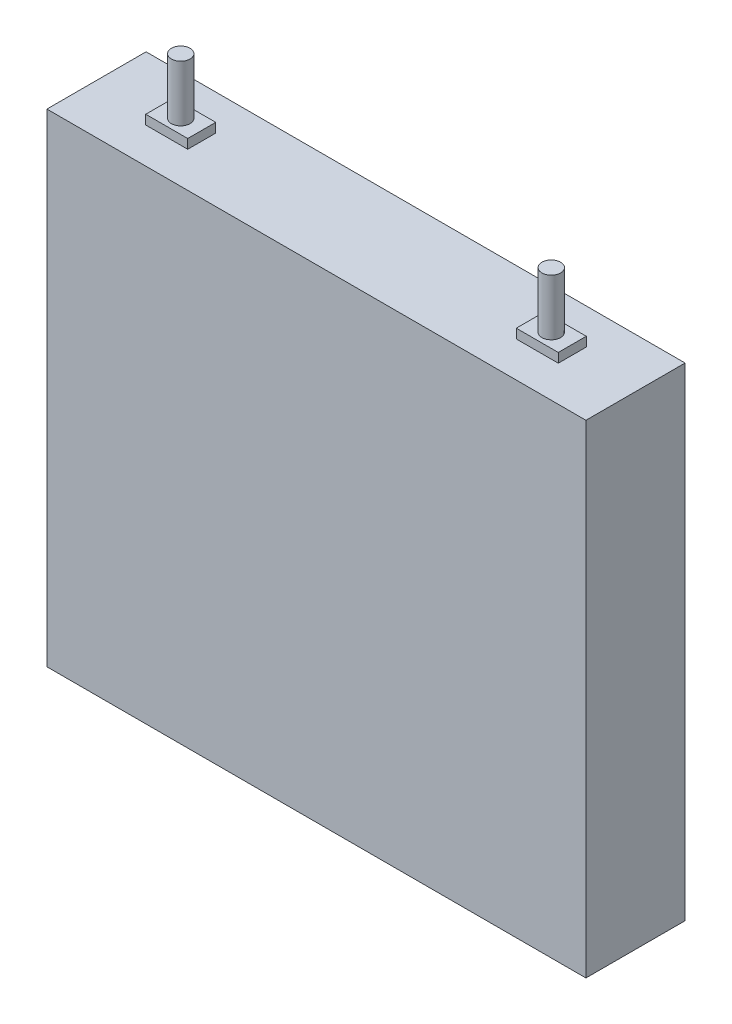
ISO-10303-21;
HEADER;
FILE_DESCRIPTION(('STEP AP214'),'2;1');
FILE_NAME('part.step','',(''),(''),'','','');
FILE_SCHEMA(('AUTOMOTIVE_DESIGN { 1 0 10303 214 1 1 1 1 }'));
ENDSEC;
DATA;
#1=APPLICATION_CONTEXT('core data for automotive mechanical design processes');
#2=APPLICATION_PROTOCOL_DEFINITION('international standard','automotive_design',2000,#1);
#3=PRODUCT_CONTEXT('',#1,'mechanical');
#4=PRODUCT('Part','Part','',(#3));
#5=PRODUCT_RELATED_PRODUCT_CATEGORY('part','',(#4));
#6=PRODUCT_DEFINITION_FORMATION('','',#4);
#7=PRODUCT_DEFINITION_CONTEXT('part definition',#1,'design');
#8=PRODUCT_DEFINITION('design','',#6,#7);
#9=PRODUCT_DEFINITION_SHAPE('','',#8);
#10=(LENGTH_UNIT() NAMED_UNIT(*) SI_UNIT(.MILLI.,.METRE.));
#11=(NAMED_UNIT(*) PLANE_ANGLE_UNIT() SI_UNIT($,.RADIAN.));
#12=(NAMED_UNIT(*) SI_UNIT($,.STERADIAN.) SOLID_ANGLE_UNIT());
#13=UNCERTAINTY_MEASURE_WITH_UNIT(LENGTH_MEASURE(1.E-05),#10,'distance_accuracy_value','');
#14=(GEOMETRIC_REPRESENTATION_CONTEXT(3) GLOBAL_UNCERTAINTY_ASSIGNED_CONTEXT((#13)) GLOBAL_UNIT_ASSIGNED_CONTEXT((#10,
#11,#12)) REPRESENTATION_CONTEXT('',''));
#15=CARTESIAN_POINT('',(0.,0.,0.));
#16=DIRECTION('',(0.,0.,1.));
#17=DIRECTION('',(1.,0.,0.));
#18=AXIS2_PLACEMENT_3D('',#15,#16,#17);
#19=CARTESIAN_POINT('',(57.75,51.75,10.625));
#20=DIRECTION('',(0.,-1.,0.));
#21=DIRECTION('',(1.,0.,0.));
#22=AXIS2_PLACEMENT_3D('',#19,#20,#21);
#23=PLANE('',#22);
#24=DIRECTION('',(0.,0.,1.));
#25=VECTOR('',#24,1.);
#26=CARTESIAN_POINT('',(-44.2,51.75,3.));
#27=LINE('',#26,#25);
#28=CARTESIAN_POINT('',(-44.2,51.75,-3.));
#29=VERTEX_POINT('',#28);
#30=CARTESIAN_POINT('',(-44.2,51.75,3.));
#31=VERTEX_POINT('',#30);
#32=EDGE_CURVE('E130',#29,#31,#27,.T.);
#33=ORIENTED_EDGE('',*,*,#32,.F.);
#34=DIRECTION('',(-1.,0.,0.));
#35=VECTOR('',#34,1.);
#36=CARTESIAN_POINT('',(-35.2,51.75,-3.));
#37=LINE('',#36,#35);
#38=CARTESIAN_POINT('',(-35.2,51.75,-3.));
#39=VERTEX_POINT('',#38);
#40=EDGE_CURVE('E163',#39,#29,#37,.T.);
#41=ORIENTED_EDGE('',*,*,#40,.F.);
#42=DIRECTION('',(0.,0.,-1.));
#43=VECTOR('',#42,1.);
#44=CARTESIAN_POINT('',(-35.2,51.75,3.));
#45=LINE('',#44,#43);
#46=CARTESIAN_POINT('',(-35.2,51.75,3.));
#47=VERTEX_POINT('',#46);
#48=EDGE_CURVE('E175',#47,#39,#45,.T.);
#49=ORIENTED_EDGE('',*,*,#48,.F.);
#50=DIRECTION('',(1.,0.,0.));
#51=VECTOR('',#50,1.);
#52=CARTESIAN_POINT('',(-35.2,51.75,3.));
#53=LINE('',#52,#51);
#54=EDGE_CURVE('E172',#31,#47,#53,.T.);
#55=ORIENTED_EDGE('',*,*,#54,.F.);
#56=EDGE_LOOP('',(#33,#41,#49,#55));
#57=FACE_BOUND('',#56,.T.);
#58=DIRECTION('',(-1.,0.,0.));
#59=VECTOR('',#58,1.);
#60=CARTESIAN_POINT('',(57.75,51.75,-10.625));
#61=LINE('',#60,#59);
#62=CARTESIAN_POINT('',(57.75,51.75,-10.625));
#63=VERTEX_POINT('',#62);
#64=CARTESIAN_POINT('',(-57.75,51.75,-10.625));
#65=VERTEX_POINT('',#64);
#66=EDGE_CURVE('E196',#63,#65,#61,.T.);
#67=ORIENTED_EDGE('',*,*,#66,.T.);
#68=DIRECTION('',(0.,0.,-1.));
#69=VECTOR('',#68,1.);
#70=CARTESIAN_POINT('',(-57.75,51.75,10.625));
#71=LINE('',#70,#69);
#72=CARTESIAN_POINT('',(-57.75,51.75,10.625));
#73=VERTEX_POINT('',#72);
#74=EDGE_CURVE('E202',#73,#65,#71,.T.);
#75=ORIENTED_EDGE('',*,*,#74,.F.);
#76=DIRECTION('',(-1.,0.,0.));
#77=VECTOR('',#76,1.);
#78=CARTESIAN_POINT('',(57.75,51.75,10.625));
#79=LINE('',#78,#77);
#80=CARTESIAN_POINT('',(57.75,51.75,10.625));
#81=VERTEX_POINT('',#80);
#82=EDGE_CURVE('E200',#81,#73,#79,.T.);
#83=ORIENTED_EDGE('',*,*,#82,.F.);
#84=DIRECTION('',(0.,0.,-1.));
#85=VECTOR('',#84,1.);
#86=CARTESIAN_POINT('',(57.75,51.75,10.625));
#87=LINE('',#86,#85);
#88=EDGE_CURVE('E212',#81,#63,#87,.T.);
#89=ORIENTED_EDGE('',*,*,#88,.T.);
#90=EDGE_LOOP('',(#67,#75,#83,#89));
#91=FACE_BOUND('',#90,.T.);
#92=DIRECTION('',(0.,0.,1.));
#93=VECTOR('',#92,1.);
#94=CARTESIAN_POINT('',(35.2,51.75,2.99999999999999));
#95=LINE('',#94,#93);
#96=CARTESIAN_POINT('',(35.2,51.75,-3.00000000000001));
#97=VERTEX_POINT('',#96);
#98=CARTESIAN_POINT('',(35.2,51.75,2.99999999999999));
#99=VERTEX_POINT('',#98);
#100=EDGE_CURVE('E124',#97,#99,#95,.T.);
#101=ORIENTED_EDGE('',*,*,#100,.F.);
#102=DIRECTION('',(-1.,0.,0.));
#103=VECTOR('',#102,1.);
#104=CARTESIAN_POINT('',(35.2,51.75,-3.00000000000001));
#105=LINE('',#104,#103);
#106=CARTESIAN_POINT('',(44.2,51.75,-3.00000000000001));
#107=VERTEX_POINT('',#106);
#108=EDGE_CURVE('E126',#107,#97,#105,.T.);
#109=ORIENTED_EDGE('',*,*,#108,.F.);
#110=DIRECTION('',(0.,0.,-1.));
#111=VECTOR('',#110,1.);
#112=CARTESIAN_POINT('',(44.2,51.75,2.99999999999999));
#113=LINE('',#112,#111);
#114=CARTESIAN_POINT('',(44.2,51.75,2.99999999999999));
#115=VERTEX_POINT('',#114);
#116=EDGE_CURVE('E59',#115,#107,#113,.T.);
#117=ORIENTED_EDGE('',*,*,#116,.F.);
#118=DIRECTION('',(1.,0.,0.));
#119=VECTOR('',#118,1.);
#120=CARTESIAN_POINT('',(35.2,51.75,2.99999999999999));
#121=LINE('',#120,#119);
#122=EDGE_CURVE('E54',#99,#115,#121,.T.);
#123=ORIENTED_EDGE('',*,*,#122,.F.);
#124=EDGE_LOOP('',(#101,#109,#117,#123));
#125=FACE_BOUND('',#124,.T.);
#126=ADVANCED_FACE('F37',(#57,#91,#125),#23,.F.);
#127=CARTESIAN_POINT('',(-57.75,-51.75,10.625));
#128=DIRECTION('',(1.,0.,0.));
#129=DIRECTION('',(0.,0.,-1.));
#130=AXIS2_PLACEMENT_3D('',#127,#128,#129);
#131=PLANE('',#130);
#132=DIRECTION('',(0.,-1.,0.));
#133=VECTOR('',#132,1.);
#134=CARTESIAN_POINT('',(-57.75,-51.75,-10.625));
#135=LINE('',#134,#133);
#136=CARTESIAN_POINT('',(-57.75,-51.75,-10.625));
#137=VERTEX_POINT('',#136);
#138=EDGE_CURVE('E191',#65,#137,#135,.T.);
#139=ORIENTED_EDGE('',*,*,#138,.T.);
#140=DIRECTION('',(0.,0.,-1.));
#141=VECTOR('',#140,1.);
#142=CARTESIAN_POINT('',(-57.75,-51.75,10.625));
#143=LINE('',#142,#141);
#144=CARTESIAN_POINT('',(-57.75,-51.75,10.625));
#145=VERTEX_POINT('',#144);
#146=EDGE_CURVE('E41',#145,#137,#143,.T.);
#147=ORIENTED_EDGE('',*,*,#146,.F.);
#148=DIRECTION('',(0.,-1.,0.));
#149=VECTOR('',#148,1.);
#150=CARTESIAN_POINT('',(-57.75,-51.75,10.625));
#151=LINE('',#150,#149);
#152=EDGE_CURVE('E192',#73,#145,#151,.T.);
#153=ORIENTED_EDGE('',*,*,#152,.F.);
#154=ORIENTED_EDGE('',*,*,#74,.T.);
#155=EDGE_LOOP('',(#139,#147,#153,#154));
#156=FACE_BOUND('',#155,.T.);
#157=ADVANCED_FACE('F39',(#156),#131,.F.);
#158=CARTESIAN_POINT('',(57.75,-51.75,10.625));
#159=DIRECTION('',(0.,1.,0.));
#160=DIRECTION('',(-1.,0.,0.));
#161=AXIS2_PLACEMENT_3D('',#158,#159,#160);
#162=PLANE('',#161);
#163=DIRECTION('',(1.,0.,0.));
#164=VECTOR('',#163,1.);
#165=CARTESIAN_POINT('',(57.75,-51.75,-10.625));
#166=LINE('',#165,#164);
#167=CARTESIAN_POINT('',(57.75,-51.75,-10.625));
#168=VERTEX_POINT('',#167);
#169=EDGE_CURVE('E205',#137,#168,#166,.T.);
#170=ORIENTED_EDGE('',*,*,#169,.T.);
#171=DIRECTION('',(0.,0.,-1.));
#172=VECTOR('',#171,1.);
#173=CARTESIAN_POINT('',(57.75,-51.75,10.625));
#174=LINE('',#173,#172);
#175=CARTESIAN_POINT('',(57.75,-51.75,10.625));
#176=VERTEX_POINT('',#175);
#177=EDGE_CURVE('E214',#176,#168,#174,.T.);
#178=ORIENTED_EDGE('',*,*,#177,.F.);
#179=DIRECTION('',(1.,0.,0.));
#180=VECTOR('',#179,1.);
#181=CARTESIAN_POINT('',(57.75,-51.75,10.625));
#182=LINE('',#181,#180);
#183=EDGE_CURVE('E195',#145,#176,#182,.T.);
#184=ORIENTED_EDGE('',*,*,#183,.F.);
#185=ORIENTED_EDGE('',*,*,#146,.T.);
#186=EDGE_LOOP('',(#170,#178,#184,#185));
#187=FACE_BOUND('',#186,.T.);
#188=ADVANCED_FACE('F261',(#187),#162,.F.);
#189=CARTESIAN_POINT('',(57.75,-51.75,10.625));
#190=DIRECTION('',(-1.,0.,0.));
#191=DIRECTION('',(0.,0.,1.));
#192=AXIS2_PLACEMENT_3D('',#189,#190,#191);
#193=PLANE('',#192);
#194=DIRECTION('',(0.,1.,0.));
#195=VECTOR('',#194,1.);
#196=CARTESIAN_POINT('',(57.75,-51.75,-10.625));
#197=LINE('',#196,#195);
#198=EDGE_CURVE('E207',#168,#63,#197,.T.);
#199=ORIENTED_EDGE('',*,*,#198,.T.);
#200=ORIENTED_EDGE('',*,*,#88,.F.);
#201=DIRECTION('',(0.,1.,0.));
#202=VECTOR('',#201,1.);
#203=CARTESIAN_POINT('',(57.75,-51.75,10.625));
#204=LINE('',#203,#202);
#205=EDGE_CURVE('E198',#176,#81,#204,.T.);
#206=ORIENTED_EDGE('',*,*,#205,.F.);
#207=ORIENTED_EDGE('',*,*,#177,.T.);
#208=EDGE_LOOP('',(#199,#200,#206,#207));
#209=FACE_BOUND('',#208,.T.);
#210=ADVANCED_FACE('F268',(#209),#193,.F.);
#211=CARTESIAN_POINT('',(0.,0.,10.625));
#212=DIRECTION('',(0.,0.,1.));
#213=DIRECTION('',(1.,0.,0.));
#214=AXIS2_PLACEMENT_3D('',#211,#212,#213);
#215=PLANE('',#214);
#216=ORIENTED_EDGE('',*,*,#152,.T.);
#217=ORIENTED_EDGE('',*,*,#183,.T.);
#218=ORIENTED_EDGE('',*,*,#205,.T.);
#219=ORIENTED_EDGE('',*,*,#82,.T.);
#220=EDGE_LOOP('',(#216,#217,#218,#219));
#221=FACE_BOUND('',#220,.T.);
#222=ADVANCED_FACE('F270',(#221),#215,.T.);
#223=CARTESIAN_POINT('',(0.,0.,-10.625));
#224=DIRECTION('',(0.,0.,1.));
#225=DIRECTION('',(1.,0.,0.));
#226=AXIS2_PLACEMENT_3D('',#223,#224,#225);
#227=PLANE('',#226);
#228=ORIENTED_EDGE('',*,*,#138,.F.);
#229=ORIENTED_EDGE('',*,*,#66,.F.);
#230=ORIENTED_EDGE('',*,*,#198,.F.);
#231=ORIENTED_EDGE('',*,*,#169,.F.);
#232=EDGE_LOOP('',(#228,#229,#230,#231));
#233=FACE_BOUND('',#232,.T.);
#234=ADVANCED_FACE('F266',(#233),#227,.F.);
#235=CARTESIAN_POINT('',(-44.2,53.75,3.));
#236=DIRECTION('',(1.,0.,0.));
#237=DIRECTION('',(0.,1.,0.));
#238=AXIS2_PLACEMENT_3D('',#235,#236,#237);
#239=PLANE('',#238);
#240=ORIENTED_EDGE('',*,*,#32,.T.);
#241=DIRECTION('',(0.,-1.,0.));
#242=VECTOR('',#241,1.);
#243=CARTESIAN_POINT('',(-44.2,53.75,3.));
#244=LINE('',#243,#242);
#245=CARTESIAN_POINT('',(-44.2,53.75,3.));
#246=VERTEX_POINT('',#245);
#247=EDGE_CURVE('E188',#246,#31,#244,.T.);
#248=ORIENTED_EDGE('',*,*,#247,.F.);
#249=DIRECTION('',(0.,0.,1.));
#250=VECTOR('',#249,1.);
#251=CARTESIAN_POINT('',(-44.2,53.75,3.));
#252=LINE('',#251,#250);
#253=CARTESIAN_POINT('',(-44.2,53.75,-3.));
#254=VERTEX_POINT('',#253);
#255=EDGE_CURVE('E159',#254,#246,#252,.T.);
#256=ORIENTED_EDGE('',*,*,#255,.F.);
#257=DIRECTION('',(0.,-1.,0.));
#258=VECTOR('',#257,1.);
#259=CARTESIAN_POINT('',(-44.2,53.75,-3.));
#260=LINE('',#259,#258);
#261=EDGE_CURVE('E169',#254,#29,#260,.T.);
#262=ORIENTED_EDGE('',*,*,#261,.T.);
#263=EDGE_LOOP('',(#240,#248,#256,#262));
#264=FACE_BOUND('',#263,.T.);
#265=ADVANCED_FACE('F286',(#264),#239,.F.);
#266=CARTESIAN_POINT('',(-35.2,53.75,3.));
#267=DIRECTION('',(0.,0.,-1.));
#268=DIRECTION('',(-1.,0.,0.));
#269=AXIS2_PLACEMENT_3D('',#266,#267,#268);
#270=PLANE('',#269);
#271=ORIENTED_EDGE('',*,*,#54,.T.);
#272=DIRECTION('',(0.,-1.,0.));
#273=VECTOR('',#272,1.);
#274=CARTESIAN_POINT('',(-35.2,53.75,3.));
#275=LINE('',#274,#273);
#276=CARTESIAN_POINT('',(-35.2,53.75,3.));
#277=VERTEX_POINT('',#276);
#278=EDGE_CURVE('E185',#277,#47,#275,.T.);
#279=ORIENTED_EDGE('',*,*,#278,.F.);
#280=DIRECTION('',(1.,0.,0.));
#281=VECTOR('',#280,1.);
#282=CARTESIAN_POINT('',(-35.2,53.75,3.));
#283=LINE('',#282,#281);
#284=EDGE_CURVE('E162',#246,#277,#283,.T.);
#285=ORIENTED_EDGE('',*,*,#284,.F.);
#286=ORIENTED_EDGE('',*,*,#247,.T.);
#287=EDGE_LOOP('',(#271,#279,#285,#286));
#288=FACE_BOUND('',#287,.T.);
#289=ADVANCED_FACE('F290',(#288),#270,.F.);
#290=CARTESIAN_POINT('',(-35.2,53.75,3.));
#291=DIRECTION('',(-1.,0.,0.));
#292=DIRECTION('',(0.,-1.,0.));
#293=AXIS2_PLACEMENT_3D('',#290,#291,#292);
#294=PLANE('',#293);
#295=ORIENTED_EDGE('',*,*,#48,.T.);
#296=DIRECTION('',(0.,-1.,0.));
#297=VECTOR('',#296,1.);
#298=CARTESIAN_POINT('',(-35.2,53.75,-3.));
#299=LINE('',#298,#297);
#300=CARTESIAN_POINT('',(-35.2,53.75,-3.));
#301=VERTEX_POINT('',#300);
#302=EDGE_CURVE('E182',#301,#39,#299,.T.);
#303=ORIENTED_EDGE('',*,*,#302,.F.);
#304=DIRECTION('',(0.,0.,-1.));
#305=VECTOR('',#304,1.);
#306=CARTESIAN_POINT('',(-35.2,53.75,3.));
#307=LINE('',#306,#305);
#308=EDGE_CURVE('E165',#277,#301,#307,.T.);
#309=ORIENTED_EDGE('',*,*,#308,.F.);
#310=ORIENTED_EDGE('',*,*,#278,.T.);
#311=EDGE_LOOP('',(#295,#303,#309,#310));
#312=FACE_BOUND('',#311,.T.);
#313=ADVANCED_FACE('F294',(#312),#294,.F.);
#314=CARTESIAN_POINT('',(-35.2,53.75,-3.));
#315=DIRECTION('',(0.,0.,1.));
#316=DIRECTION('',(1.,0.,0.));
#317=AXIS2_PLACEMENT_3D('',#314,#315,#316);
#318=PLANE('',#317);
#319=ORIENTED_EDGE('',*,*,#40,.T.);
#320=ORIENTED_EDGE('',*,*,#261,.F.);
#321=DIRECTION('',(-1.,0.,0.));
#322=VECTOR('',#321,1.);
#323=CARTESIAN_POINT('',(-35.2,53.75,-3.));
#324=LINE('',#323,#322);
#325=EDGE_CURVE('E167',#301,#254,#324,.T.);
#326=ORIENTED_EDGE('',*,*,#325,.F.);
#327=ORIENTED_EDGE('',*,*,#302,.T.);
#328=EDGE_LOOP('',(#319,#320,#326,#327));
#329=FACE_BOUND('',#328,.T.);
#330=ADVANCED_FACE('F298',(#329),#318,.F.);
#331=CARTESIAN_POINT('',(0.,53.75,0.));
#332=DIRECTION('',(0.,1.,0.));
#333=DIRECTION('',(0.,0.,1.));
#334=AXIS2_PLACEMENT_3D('',#331,#332,#333);
#335=PLANE('',#334);
#336=CARTESIAN_POINT('',(-39.7,53.75,0.));
#337=DIRECTION('',(0.,1.,0.));
#338=DIRECTION('',(0.,0.,1.));
#339=AXIS2_PLACEMENT_3D('',#336,#337,#338);
#340=CIRCLE('',#339,2.);
#341=CARTESIAN_POINT('',(-39.7,53.75,2.));
#342=VERTEX_POINT('',#341);
#343=EDGE_CURVE('E46',#342,#342,#340,.T.);
#344=ORIENTED_EDGE('',*,*,#343,.F.);
#345=EDGE_LOOP('',(#344));
#346=FACE_BOUND('',#345,.T.);
#347=ORIENTED_EDGE('',*,*,#255,.T.);
#348=ORIENTED_EDGE('',*,*,#284,.T.);
#349=ORIENTED_EDGE('',*,*,#308,.T.);
#350=ORIENTED_EDGE('',*,*,#325,.T.);
#351=EDGE_LOOP('',(#347,#348,#349,#350));
#352=FACE_BOUND('',#351,.T.);
#353=ADVANCED_FACE('F301',(#346,#352),#335,.T.);
#354=CARTESIAN_POINT('',(35.2,53.75,2.99999999999999));
#355=DIRECTION('',(1.,0.,0.));
#356=DIRECTION('',(0.,1.,0.));
#357=AXIS2_PLACEMENT_3D('',#354,#355,#356);
#358=PLANE('',#357);
#359=ORIENTED_EDGE('',*,*,#100,.T.);
#360=DIRECTION('',(0.,-1.,0.));
#361=VECTOR('',#360,1.);
#362=CARTESIAN_POINT('',(35.2,53.75,2.99999999999999));
#363=LINE('',#362,#361);
#364=CARTESIAN_POINT('',(35.2,53.75,2.99999999999999));
#365=VERTEX_POINT('',#364);
#366=EDGE_CURVE('E231',#365,#99,#363,.T.);
#367=ORIENTED_EDGE('',*,*,#366,.F.);
#368=DIRECTION('',(0.,0.,1.));
#369=VECTOR('',#368,1.);
#370=CARTESIAN_POINT('',(35.2,53.75,2.99999999999999));
#371=LINE('',#370,#369);
#372=CARTESIAN_POINT('',(35.2,53.75,-3.00000000000001));
#373=VERTEX_POINT('',#372);
#374=EDGE_CURVE('E141',#373,#365,#371,.T.);
#375=ORIENTED_EDGE('',*,*,#374,.F.);
#376=DIRECTION('',(0.,-1.,0.));
#377=VECTOR('',#376,1.);
#378=CARTESIAN_POINT('',(35.2,53.75,-3.00000000000001));
#379=LINE('',#378,#377);
#380=EDGE_CURVE('E137',#373,#97,#379,.T.);
#381=ORIENTED_EDGE('',*,*,#380,.T.);
#382=EDGE_LOOP('',(#359,#367,#375,#381));
#383=FACE_BOUND('',#382,.T.);
#384=ADVANCED_FACE('F143',(#383),#358,.F.);
#385=CARTESIAN_POINT('',(35.2,53.75,2.99999999999999));
#386=DIRECTION('',(0.,0.,-1.));
#387=DIRECTION('',(-1.,0.,0.));
#388=AXIS2_PLACEMENT_3D('',#385,#386,#387);
#389=PLANE('',#388);
#390=ORIENTED_EDGE('',*,*,#122,.T.);
#391=DIRECTION('',(0.,-1.,0.));
#392=VECTOR('',#391,1.);
#393=CARTESIAN_POINT('',(44.2,53.75,2.99999999999999));
#394=LINE('',#393,#392);
#395=CARTESIAN_POINT('',(44.2,53.75,2.99999999999999));
#396=VERTEX_POINT('',#395);
#397=EDGE_CURVE('E149',#396,#115,#394,.T.);
#398=ORIENTED_EDGE('',*,*,#397,.F.);
#399=DIRECTION('',(1.,0.,0.));
#400=VECTOR('',#399,1.);
#401=CARTESIAN_POINT('',(35.2,53.75,2.99999999999999));
#402=LINE('',#401,#400);
#403=EDGE_CURVE('E156',#365,#396,#402,.T.);
#404=ORIENTED_EDGE('',*,*,#403,.F.);
#405=ORIENTED_EDGE('',*,*,#366,.T.);
#406=EDGE_LOOP('',(#390,#398,#404,#405));
#407=FACE_BOUND('',#406,.T.);
#408=ADVANCED_FACE('F238',(#407),#389,.F.);
#409=CARTESIAN_POINT('',(44.2,53.75,2.99999999999999));
#410=DIRECTION('',(-1.,0.,0.));
#411=DIRECTION('',(0.,-1.,0.));
#412=AXIS2_PLACEMENT_3D('',#409,#410,#411);
#413=PLANE('',#412);
#414=ORIENTED_EDGE('',*,*,#116,.T.);
#415=DIRECTION('',(0.,-1.,0.));
#416=VECTOR('',#415,1.);
#417=CARTESIAN_POINT('',(44.2,53.75,-3.00000000000001));
#418=LINE('',#417,#416);
#419=CARTESIAN_POINT('',(44.2,53.75,-3.00000000000001));
#420=VERTEX_POINT('',#419);
#421=EDGE_CURVE('E140',#420,#107,#418,.T.);
#422=ORIENTED_EDGE('',*,*,#421,.F.);
#423=DIRECTION('',(0.,0.,-1.));
#424=VECTOR('',#423,1.);
#425=CARTESIAN_POINT('',(44.2,53.75,2.99999999999999));
#426=LINE('',#425,#424);
#427=EDGE_CURVE('E147',#396,#420,#426,.T.);
#428=ORIENTED_EDGE('',*,*,#427,.F.);
#429=ORIENTED_EDGE('',*,*,#397,.T.);
#430=EDGE_LOOP('',(#414,#422,#428,#429));
#431=FACE_BOUND('',#430,.T.);
#432=ADVANCED_FACE('F236',(#431),#413,.F.);
#433=CARTESIAN_POINT('',(35.2,53.75,-3.00000000000001));
#434=DIRECTION('',(0.,0.,1.));
#435=DIRECTION('',(1.,0.,0.));
#436=AXIS2_PLACEMENT_3D('',#433,#434,#435);
#437=PLANE('',#436);
#438=ORIENTED_EDGE('',*,*,#108,.T.);
#439=ORIENTED_EDGE('',*,*,#380,.F.);
#440=DIRECTION('',(-1.,0.,0.));
#441=VECTOR('',#440,1.);
#442=CARTESIAN_POINT('',(35.2,53.75,-3.00000000000001));
#443=LINE('',#442,#441);
#444=EDGE_CURVE('E145',#420,#373,#443,.T.);
#445=ORIENTED_EDGE('',*,*,#444,.F.);
#446=ORIENTED_EDGE('',*,*,#421,.T.);
#447=EDGE_LOOP('',(#438,#439,#445,#446));
#448=FACE_BOUND('',#447,.T.);
#449=ADVANCED_FACE('F135',(#448),#437,.F.);
#450=CARTESIAN_POINT('',(0.,53.75,0.));
#451=DIRECTION('',(0.,-1.,0.));
#452=DIRECTION('',(0.,0.,-1.));
#453=AXIS2_PLACEMENT_3D('',#450,#451,#452);
#454=PLANE('',#453);
#455=CARTESIAN_POINT('',(39.7,53.75,0.));
#456=DIRECTION('',(0.,1.,0.));
#457=DIRECTION('',(0.,0.,-1.));
#458=AXIS2_PLACEMENT_3D('',#455,#456,#457);
#459=CIRCLE('',#458,2.);
#460=CARTESIAN_POINT('',(39.7,53.75,-2.));
#461=VERTEX_POINT('',#460);
#462=EDGE_CURVE('E11',#461,#461,#459,.T.);
#463=ORIENTED_EDGE('',*,*,#462,.F.);
#464=EDGE_LOOP('',(#463));
#465=FACE_BOUND('',#464,.T.);
#466=ORIENTED_EDGE('',*,*,#374,.T.);
#467=ORIENTED_EDGE('',*,*,#403,.T.);
#468=ORIENTED_EDGE('',*,*,#427,.T.);
#469=ORIENTED_EDGE('',*,*,#444,.T.);
#470=EDGE_LOOP('',(#466,#467,#468,#469));
#471=FACE_BOUND('',#470,.T.);
#472=ADVANCED_FACE('F240',(#465,#471),#454,.F.);
#473=CARTESIAN_POINT('',(-39.7,65.75,0.));
#474=DIRECTION('',(0.,-1.,0.));
#475=DIRECTION('',(0.,0.,-1.));
#476=AXIS2_PLACEMENT_3D('',#473,#474,#475);
#477=CYLINDRICAL_SURFACE('',#476,2.);
#478=CARTESIAN_POINT('',(-39.7,65.75,0.));
#479=DIRECTION('',(0.,1.,0.));
#480=DIRECTION('',(0.,0.,1.));
#481=AXIS2_PLACEMENT_3D('',#478,#479,#480);
#482=CIRCLE('',#481,2.);
#483=CARTESIAN_POINT('',(-39.7,65.75,2.));
#484=VERTEX_POINT('',#483);
#485=EDGE_CURVE('E229',#484,#484,#482,.T.);
#486=ORIENTED_EDGE('',*,*,#485,.F.);
#487=EDGE_LOOP('',(#486));
#488=FACE_BOUND('',#487,.T.);
#489=ORIENTED_EDGE('',*,*,#343,.T.);
#490=EDGE_LOOP('',(#489));
#491=FACE_BOUND('',#490,.T.);
#492=ADVANCED_FACE('F242',(#488,#491),#477,.T.);
#493=CARTESIAN_POINT('',(-39.7,65.75,0.));
#494=DIRECTION('',(0.,1.,0.));
#495=DIRECTION('',(0.,0.,1.));
#496=AXIS2_PLACEMENT_3D('',#493,#494,#495);
#497=PLANE('',#496);
#498=ORIENTED_EDGE('',*,*,#485,.T.);
#499=EDGE_LOOP('',(#498));
#500=FACE_BOUND('',#499,.T.);
#501=ADVANCED_FACE('F249',(#500),#497,.T.);
#502=CARTESIAN_POINT('',(39.7,65.75,0.));
#503=DIRECTION('',(0.,-1.,0.));
#504=DIRECTION('',(0.,0.,-1.));
#505=AXIS2_PLACEMENT_3D('',#502,#503,#504);
#506=CYLINDRICAL_SURFACE('',#505,2.);
#507=CARTESIAN_POINT('',(39.7,65.75,0.));
#508=DIRECTION('',(0.,1.,0.));
#509=DIRECTION('',(0.,0.,-1.));
#510=AXIS2_PLACEMENT_3D('',#507,#508,#509);
#511=CIRCLE('',#510,2.);
#512=CARTESIAN_POINT('',(39.7,65.75,-2.));
#513=VERTEX_POINT('',#512);
#514=EDGE_CURVE('E484',#513,#513,#511,.T.);
#515=ORIENTED_EDGE('',*,*,#514,.F.);
#516=EDGE_LOOP('',(#515));
#517=FACE_BOUND('',#516,.T.);
#518=ORIENTED_EDGE('',*,*,#462,.T.);
#519=EDGE_LOOP('',(#518));
#520=FACE_BOUND('',#519,.T.);
#521=ADVANCED_FACE('F361',(#517,#520),#506,.T.);
#522=CARTESIAN_POINT('',(39.7,65.75,0.));
#523=DIRECTION('',(0.,-1.,0.));
#524=DIRECTION('',(0.,0.,-1.));
#525=AXIS2_PLACEMENT_3D('',#522,#523,#524);
#526=PLANE('',#525);
#527=ORIENTED_EDGE('',*,*,#514,.T.);
#528=EDGE_LOOP('',(#527));
#529=FACE_BOUND('',#528,.T.);
#530=ADVANCED_FACE('F371',(#529),#526,.F.);
#531=CLOSED_SHELL('',(#126,#157,#188,#210,#222,#234,#265,#289,#313,#330,#353,#384,#408,#432,
#449,#472,#492,#501,#521,#530));
#532=MANIFOLD_SOLID_BREP('B2',#531);
#533=ADVANCED_BREP_SHAPE_REPRESENTATION('',(#18,#532),#14);
#534=SHAPE_DEFINITION_REPRESENTATION(#9,#533);
ENDSEC;
END-ISO-10303-21;
